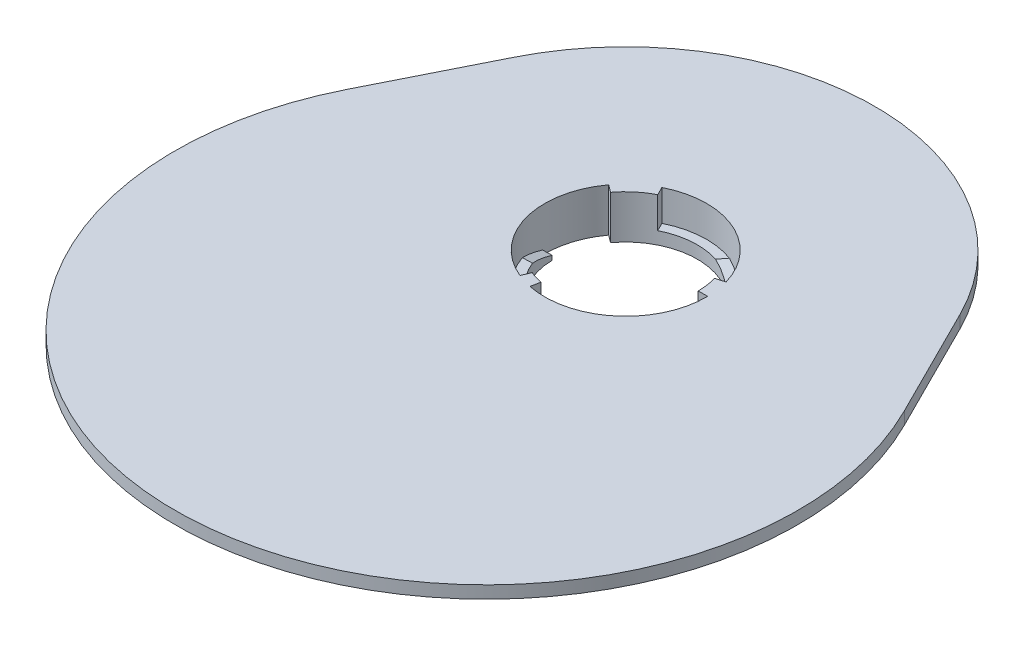
ISO-10303-21;
HEADER;
FILE_DESCRIPTION(('STEP AP214'),'2;1');
FILE_NAME('part.step','',(''),(''),'','','');
FILE_SCHEMA(('AUTOMOTIVE_DESIGN { 1 0 10303 214 1 1 1 1 }'));
ENDSEC;
DATA;
#1=APPLICATION_CONTEXT('core data for automotive mechanical design processes');
#2=APPLICATION_PROTOCOL_DEFINITION('international standard','automotive_design',2000,#1);
#3=PRODUCT_CONTEXT('',#1,'mechanical');
#4=PRODUCT('Part','Part','',(#3));
#5=PRODUCT_RELATED_PRODUCT_CATEGORY('part','',(#4));
#6=PRODUCT_DEFINITION_FORMATION('','',#4);
#7=PRODUCT_DEFINITION_CONTEXT('part definition',#1,'design');
#8=PRODUCT_DEFINITION('design','',#6,#7);
#9=PRODUCT_DEFINITION_SHAPE('','',#8);
#10=(LENGTH_UNIT() NAMED_UNIT(*) SI_UNIT(.MILLI.,.METRE.));
#11=(NAMED_UNIT(*) PLANE_ANGLE_UNIT() SI_UNIT($,.RADIAN.));
#12=(NAMED_UNIT(*) SI_UNIT($,.STERADIAN.) SOLID_ANGLE_UNIT());
#13=UNCERTAINTY_MEASURE_WITH_UNIT(LENGTH_MEASURE(1.E-05),#10,'distance_accuracy_value','');
#14=(GEOMETRIC_REPRESENTATION_CONTEXT(3) GLOBAL_UNCERTAINTY_ASSIGNED_CONTEXT((#13)) GLOBAL_UNIT_ASSIGNED_CONTEXT((#10,
#11,#12)) REPRESENTATION_CONTEXT('',''));
#15=CARTESIAN_POINT('',(0.,0.,0.));
#16=DIRECTION('',(0.,0.,1.));
#17=DIRECTION('',(1.,0.,0.));
#18=AXIS2_PLACEMENT_3D('',#15,#16,#17);
#19=CARTESIAN_POINT('',(0.,2.,0.));
#20=DIRECTION('',(0.,-1.,0.));
#21=DIRECTION('',(0.,0.,-1.));
#22=AXIS2_PLACEMENT_3D('',#19,#20,#21);
#23=CYLINDRICAL_SURFACE('',#22,13.);
#24=CARTESIAN_POINT('',(0.,2.,0.));
#25=DIRECTION('',(0.,1.,0.));
#26=DIRECTION('',(0.,0.,1.));
#27=AXIS2_PLACEMENT_3D('',#24,#25,#26);
#28=CIRCLE('',#27,13.);
#29=CARTESIAN_POINT('',(-2.65205474774603,2.,12.7266101384052));
#30=VERTEX_POINT('',#29);
#31=CARTESIAN_POINT('',(12.9989483680419,2.,-0.165352124209134));
#32=VERTEX_POINT('',#31);
#33=EDGE_CURVE('E241',#30,#32,#28,.T.);
#34=ORIENTED_EDGE('',*,*,#33,.T.);
#35=DIRECTION('',(0.,-1.,0.));
#36=VECTOR('',#35,1.);
#37=CARTESIAN_POINT('',(12.9989483680419,9.16077384253368,-0.165352124209134));
#38=LINE('',#37,#36);
#39=CARTESIAN_POINT('',(12.9989483680419,-3.,-0.165352124209134));
#40=VERTEX_POINT('',#39);
#41=EDGE_CURVE('E466',#32,#40,#38,.T.);
#42=ORIENTED_EDGE('',*,*,#41,.T.);
#43=CARTESIAN_POINT('',(0.,-3.,0.));
#44=DIRECTION('',(0.,-1.,0.));
#45=DIRECTION('',(0.,0.,-1.));
#46=AXIS2_PLACEMENT_3D('',#43,#44,#45);
#47=CIRCLE('',#46,13.);
#48=CARTESIAN_POINT('',(8.80833238270036,-3.,9.56102926655243));
#49=VERTEX_POINT('',#48);
#50=EDGE_CURVE('E419',#49,#40,#47,.F.);
#51=ORIENTED_EDGE('',*,*,#50,.F.);
#52=CARTESIAN_POINT('',(0.,-4.3,0.));
#53=DIRECTION('',(0.280679552847862,-0.951056516295154,-0.129269066004402));
#54=DIRECTION('',(-0.863842839021577,-0.309016994374947,0.397849276307769));
#55=AXIS2_PLACEMENT_3D('',#52,#53,#54);
#56=ELLIPSE('',#55,13.6690089150975,13.);
#57=CARTESIAN_POINT('',(5.43820530471597,-4.3,11.8078754678291));
#58=VERTEX_POINT('',#57);
#59=EDGE_CURVE('E316',#49,#58,#56,.T.);
#60=ORIENTED_EDGE('',*,*,#59,.T.);
#61=DIRECTION('',(0.,-1.,0.));
#62=VECTOR('',#61,1.);
#63=CARTESIAN_POINT('',(5.43820530471597,-3.,11.8078754678291));
#64=LINE('',#63,#62);
#65=CARTESIAN_POINT('',(5.43820530471597,-5.,11.8078754678291));
#66=VERTEX_POINT('',#65);
#67=EDGE_CURVE('E225',#58,#66,#64,.T.);
#68=ORIENTED_EDGE('',*,*,#67,.T.);
#69=CARTESIAN_POINT('',(0.,-5.,0.));
#70=DIRECTION('',(0.,-1.,0.));
#71=DIRECTION('',(0.,0.,-1.));
#72=AXIS2_PLACEMENT_3D('',#69,#70,#71);
#73=CIRCLE('',#72,13.);
#74=CARTESIAN_POINT('',(-2.65205474774603,-5.,12.7266101384052));
#75=VERTEX_POINT('',#74);
#76=EDGE_CURVE('E387',#66,#75,#73,.T.);
#77=ORIENTED_EDGE('',*,*,#76,.T.);
#78=DIRECTION('',(0.,-1.,0.));
#79=VECTOR('',#78,1.);
#80=CARTESIAN_POINT('',(-2.65205474774603,-3.,12.7266101384052));
#81=LINE('',#80,#79);
#82=EDGE_CURVE('E333',#30,#75,#81,.T.);
#83=ORIENTED_EDGE('',*,*,#82,.F.);
#84=EDGE_LOOP('',(#34,#42,#51,#60,#68,#77,#83));
#85=FACE_BOUND('',#84,.T.);
#86=ADVANCED_FACE('F49',(#85),#23,.F.);
#87=CARTESIAN_POINT('',(0.,-3.,0.));
#88=DIRECTION('',(0.,-1.,0.));
#89=DIRECTION('',(0.,0.,-1.));
#90=AXIS2_PLACEMENT_3D('',#87,#88,#89);
#91=PLANE('',#90);
#92=CARTESIAN_POINT('',(0.,-3.,0.));
#93=DIRECTION('',(0.,-1.,0.));
#94=DIRECTION('',(0.,0.,-1.));
#95=AXIS2_PLACEMENT_3D('',#92,#93,#94);
#96=CIRCLE('',#95,11.5);
#97=CARTESIAN_POINT('',(11.499069710191,-3.,-0.146273032954234));
#98=VERTEX_POINT('',#97);
#99=CARTESIAN_POINT('',(8.14427119786115,-3.,8.11916539157135));
#100=VERTEX_POINT('',#99);
#101=EDGE_CURVE('E416',#98,#100,#96,.T.);
#102=ORIENTED_EDGE('',*,*,#101,.T.);
#103=DIRECTION('',(0.418323484978152,0.,0.908298112909927));
#104=VECTOR('',#103,1.);
#105=CARTESIAN_POINT('',(3.63409039363529,-3.,-1.67370749381035));
#106=LINE('',#105,#104);
#107=EDGE_CURVE('E296',#100,#49,#106,.T.);
#108=ORIENTED_EDGE('',*,*,#107,.T.);
#109=ORIENTED_EDGE('',*,*,#50,.T.);
#110=DIRECTION('',(0.999919105233993,0.,-0.0127193941699334));
#111=VECTOR('',#110,1.);
#112=CARTESIAN_POINT('',(0.,-3.,0.));
#113=LINE('',#112,#111);
#114=EDGE_CURVE('E293',#98,#40,#113,.T.);
#115=ORIENTED_EDGE('',*,*,#114,.F.);
#116=EDGE_LOOP('',(#102,#108,#109,#115));
#117=FACE_BOUND('',#116,.T.);
#118=ADVANCED_FACE('F482',(#117),#91,.F.);
#119=CARTESIAN_POINT('',(-10.4594726894119,2.,-7.72006677817277));
#120=VERTEX_POINT('',#119);
#121=CARTESIAN_POINT('',(-4.96037234143088,2.,12.0164348387684));
#122=VERTEX_POINT('',#121);
#123=EDGE_CURVE('E244',#120,#122,#28,.T.);
#124=ORIENTED_EDGE('',*,*,#123,.T.);
#125=DIRECTION('',(0.,-1.,0.));
#126=VECTOR('',#125,1.);
#127=CARTESIAN_POINT('',(-4.96037234143088,9.16077384253368,12.0164348387684));
#128=LINE('',#127,#126);
#129=CARTESIAN_POINT('',(-4.96037234143088,-3.,12.0164348387684));
#130=VERTEX_POINT('',#129);
#131=EDGE_CURVE('E233',#122,#130,#128,.T.);
#132=ORIENTED_EDGE('',*,*,#131,.T.);
#133=CARTESIAN_POINT('',(0.,-3.,0.));
#134=DIRECTION('',(0.,-1.,0.));
#135=DIRECTION('',(0.,0.,-1.));
#136=AXIS2_PLACEMENT_3D('',#133,#134,#135);
#137=CIRCLE('',#136,13.);
#138=CARTESIAN_POINT('',(-12.254793292292,-3.,4.33820716001376));
#139=VERTEX_POINT('',#138);
#140=EDGE_CURVE('E322',#139,#130,#137,.F.);
#141=ORIENTED_EDGE('',*,*,#140,.F.);
#142=CARTESIAN_POINT('',(0.,-4.29999999999999,0.));
#143=DIRECTION('',(0.00846228176161861,-0.951056516295154,0.308901104886196));
#144=DIRECTION('',(-0.0260442252646721,-0.309016994374947,-0.950699845123495));
#145=AXIS2_PLACEMENT_3D('',#142,#143,#144);
#146=ELLIPSE('',#145,13.6690089150975,13.);
#147=CARTESIAN_POINT('',(-12.9951246585748,-4.29999999999999,0.355998747329609));
#148=VERTEX_POINT('',#147);
#149=EDGE_CURVE('E58',#139,#148,#146,.T.);
#150=ORIENTED_EDGE('',*,*,#149,.T.);
#151=DIRECTION('',(0.,-1.,0.));
#152=VECTOR('',#151,1.);
#153=CARTESIAN_POINT('',(-12.9951246585748,-3.,0.355998747329609));
#154=LINE('',#153,#152);
#155=CARTESIAN_POINT('',(-12.9951246585748,-5.,0.355998747329609));
#156=VERTEX_POINT('',#155);
#157=EDGE_CURVE('E320',#148,#156,#154,.T.);
#158=ORIENTED_EDGE('',*,*,#157,.T.);
#159=CARTESIAN_POINT('',(-10.4594726894119,-5.,-7.72006677817277));
#160=VERTEX_POINT('',#159);
#161=EDGE_CURVE('E380',#156,#160,#73,.T.);
#162=ORIENTED_EDGE('',*,*,#161,.T.);
#163=DIRECTION('',(0.,-1.,0.));
#164=VECTOR('',#163,1.);
#165=CARTESIAN_POINT('',(-10.4594726894119,-3.,-7.72006677817277));
#166=LINE('',#165,#164);
#167=EDGE_CURVE('E383',#120,#160,#166,.T.);
#168=ORIENTED_EDGE('',*,*,#167,.F.);
#169=EDGE_LOOP('',(#124,#132,#141,#150,#158,#162,#168));
#170=FACE_BOUND('',#169,.T.);
#171=ADVANCED_FACE('F319',(#170),#23,.F.);
#172=CARTESIAN_POINT('',(0.,-3.,0.));
#173=DIRECTION('',(0.,-1.,0.));
#174=DIRECTION('',(0.,0.,-1.));
#175=AXIS2_PLACEMENT_3D('',#172,#173,#174);
#176=PLANE('',#175);
#177=CARTESIAN_POINT('',(0.,-3.,0.));
#178=DIRECTION('',(0.,-1.,0.));
#179=DIRECTION('',(0.,0.,-1.));
#180=AXIS2_PLACEMENT_3D('',#177,#178,#179);
#181=CIRCLE('',#180,11.5);
#182=CARTESIAN_POINT('',(-4.3880216866504,-3.,10.6299231266029));
#183=VERTEX_POINT('',#182);
#184=CARTESIAN_POINT('',(-10.6679539961693,-3.,4.29473602630206));
#185=VERTEX_POINT('',#184);
#186=EDGE_CURVE('E342',#183,#185,#181,.T.);
#187=ORIENTED_EDGE('',*,*,#186,.T.);
#188=DIRECTION('',(-0.999624973736526,0.,0.0273845190253546));
#189=VECTOR('',#188,1.);
#190=CARTESIAN_POINT('',(0.109565148391134,-3.,3.99948812252357));
#191=LINE('',#190,#189);
#192=EDGE_CURVE('E303',#185,#139,#191,.T.);
#193=ORIENTED_EDGE('',*,*,#192,.T.);
#194=ORIENTED_EDGE('',*,*,#140,.T.);
#195=DIRECTION('',(-0.381567103186991,0.,0.924341141443725));
#196=VECTOR('',#195,1.);
#197=CARTESIAN_POINT('',(0.,-3.,0.));
#198=LINE('',#197,#196);
#199=EDGE_CURVE('E290',#183,#130,#198,.T.);
#200=ORIENTED_EDGE('',*,*,#199,.F.);
#201=EDGE_LOOP('',(#187,#193,#194,#200));
#202=FACE_BOUND('',#201,.T.);
#203=ADVANCED_FACE('F346',(#202),#176,.F.);
#204=DIRECTION('',(0.,-1.,0.));
#205=VECTOR('',#204,1.);
#206=CARTESIAN_POINT('',(12.481994073977,-3.,-3.6331561949913));
#207=LINE('',#206,#205);
#208=CARTESIAN_POINT('',(12.481994073977,2.,-3.6331561949913));
#209=VERTEX_POINT('',#208);
#210=CARTESIAN_POINT('',(12.481994073977,-5.,-3.6331561949913));
#211=VERTEX_POINT('',#210);
#212=EDGE_CURVE('E213',#209,#211,#207,.T.);
#213=ORIENTED_EDGE('',*,*,#212,.F.);
#214=CARTESIAN_POINT('',(-5.81462143119073,2.,-11.6271310998001));
#215=VERTEX_POINT('',#214);
#216=EDGE_CURVE('E218',#209,#215,#28,.T.);
#217=ORIENTED_EDGE('',*,*,#216,.T.);
#218=DIRECTION('',(0.,-1.,0.));
#219=VECTOR('',#218,1.);
#220=CARTESIAN_POINT('',(-5.81462143119073,9.16077384253368,-11.6271310998001));
#221=LINE('',#220,#219);
#222=CARTESIAN_POINT('',(-5.81462143119073,-3.,-11.6271310998001));
#223=VERTEX_POINT('',#222);
#224=EDGE_CURVE('E414',#215,#223,#221,.T.);
#225=ORIENTED_EDGE('',*,*,#224,.T.);
#226=CARTESIAN_POINT('',(0.,-3.,0.));
#227=DIRECTION('',(0.,-1.,0.));
#228=DIRECTION('',(0.,0.,-1.));
#229=AXIS2_PLACEMENT_3D('',#226,#227,#228);
#230=CIRCLE('',#229,13.);
#231=CARTESIAN_POINT('',(4.44753981473777,-3.,-12.2155388582052));
#232=VERTEX_POINT('',#231);
#233=EDGE_CURVE('E367',#232,#223,#230,.F.);
#234=ORIENTED_EDGE('',*,*,#233,.F.);
#235=CARTESIAN_POINT('',(0.,-4.3,0.));
#236=DIRECTION('',(-0.243738359488238,-0.951056516295153,-0.18995556039903));
#237=DIRECTION('',(0.750149536375051,-0.309016994374948,0.584623101034991));
#238=AXIS2_PLACEMENT_3D('',#235,#236,#237);
#239=ELLIPSE('',#238,13.6690089150975,13.);
#240=CARTESIAN_POINT('',(7.99121838001923,-4.3,-10.2538007003668));
#241=VERTEX_POINT('',#240);
#242=EDGE_CURVE('E13',#232,#241,#239,.T.);
#243=ORIENTED_EDGE('',*,*,#242,.T.);
#244=DIRECTION('',(0.,-1.,0.));
#245=VECTOR('',#244,1.);
#246=CARTESIAN_POINT('',(7.99121838001923,-3.,-10.2538007003668));
#247=LINE('',#246,#245);
#248=CARTESIAN_POINT('',(7.99121838001923,-5.,-10.2538007003668));
#249=VERTEX_POINT('',#248);
#250=EDGE_CURVE('E381',#241,#249,#247,.T.);
#251=ORIENTED_EDGE('',*,*,#250,.T.);
#252=EDGE_CURVE('E221',#249,#211,#73,.T.);
#253=ORIENTED_EDGE('',*,*,#252,.T.);
#254=EDGE_LOOP('',(#213,#217,#225,#234,#243,#251,#253));
#255=FACE_BOUND('',#254,.T.);
#256=ADVANCED_FACE('F215',(#255),#23,.F.);
#257=CARTESIAN_POINT('',(0.,-3.,0.));
#258=DIRECTION('',(0.,-1.,0.));
#259=DIRECTION('',(0.,0.,-1.));
#260=AXIS2_PLACEMENT_3D('',#257,#258,#259);
#261=PLANE('',#260);
#262=CARTESIAN_POINT('',(0.,-3.,0.));
#263=DIRECTION('',(0.,-1.,0.));
#264=DIRECTION('',(0.,0.,-1.));
#265=AXIS2_PLACEMENT_3D('',#262,#263,#264);
#266=CIRCLE('',#265,11.5);
#267=CARTESIAN_POINT('',(-5.14370357374565,-3.,-10.2855390498231));
#268=VERTEX_POINT('',#267);
#269=CARTESIAN_POINT('',(3.47172929483287,-3.,-10.9634436060665));
#270=VERTEX_POINT('',#269);
#271=EDGE_CURVE('E364',#268,#270,#266,.T.);
#272=ORIENTED_EDGE('',*,*,#271,.T.);
#273=DIRECTION('',(0.614709106155325,0.,-0.788753900028216));
#274=VECTOR('',#273,1.);
#275=CARTESIAN_POINT('',(-3.15579536089948,-3.,-2.45944412501573));
#276=LINE('',#275,#274);
#277=EDGE_CURVE('E310',#270,#232,#276,.T.);
#278=ORIENTED_EDGE('',*,*,#277,.T.);
#279=ORIENTED_EDGE('',*,*,#233,.T.);
#280=DIRECTION('',(-0.447278571630056,0.,-0.894394699984619));
#281=VECTOR('',#280,1.);
#282=CARTESIAN_POINT('',(0.,-3.,0.));
#283=LINE('',#282,#281);
#284=EDGE_CURVE('E287',#268,#223,#283,.T.);
#285=ORIENTED_EDGE('',*,*,#284,.F.);
#286=EDGE_LOOP('',(#272,#278,#279,#285));
#287=FACE_BOUND('',#286,.T.);
#288=ADVANCED_FACE('F446',(#287),#261,.F.);
#289=CARTESIAN_POINT('',(0.,0.,0.));
#290=DIRECTION('',(0.,-1.,0.));
#291=DIRECTION('',(0.,0.,-1.));
#292=AXIS2_PLACEMENT_3D('',#289,#290,#291);
#293=PLANE('',#292);
#294=CARTESIAN_POINT('',(0.,0.,0.));
#295=DIRECTION('',(0.,1.,0.));
#296=DIRECTION('',(0.,0.,-1.));
#297=AXIS2_PLACEMENT_3D('',#294,#295,#296);
#298=CIRCLE('',#297,40.);
#299=CARTESIAN_POINT('',(35.7770876399966,0.,-17.8885438199983));
#300=VERTEX_POINT('',#299);
#301=CARTESIAN_POINT('',(-35.7770876399966,0.,-17.8885438199983));
#302=VERTEX_POINT('',#301);
#303=EDGE_CURVE('E250',#300,#302,#298,.T.);
#304=ORIENTED_EDGE('',*,*,#303,.F.);
#305=DIRECTION('',(-0.447213595499958,0.,-0.894427190999916));
#306=VECTOR('',#305,1.);
#307=CARTESIAN_POINT('',(35.7770876399966,0.,-17.8885438199983));
#308=LINE('',#307,#306);
#309=CARTESIAN_POINT('',(44.7213595499958,0.,0.));
#310=VERTEX_POINT('',#309);
#311=EDGE_CURVE('E267',#310,#300,#308,.T.);
#312=ORIENTED_EDGE('',*,*,#311,.F.);
#313=CARTESIAN_POINT('',(0.,0.,22.3606797749979));
#314=DIRECTION('',(0.,1.,0.));
#315=DIRECTION('',(0.,0.,1.));
#316=AXIS2_PLACEMENT_3D('',#313,#314,#315);
#317=CIRCLE('',#316,50.);
#318=CARTESIAN_POINT('',(-44.7213595499958,0.,0.));
#319=VERTEX_POINT('',#318);
#320=EDGE_CURVE('E260',#319,#310,#317,.T.);
#321=ORIENTED_EDGE('',*,*,#320,.F.);
#322=DIRECTION('',(-0.447213595499958,0.,0.894427190999916));
#323=VECTOR('',#322,1.);
#324=CARTESIAN_POINT('',(-35.7770876399966,0.,-17.8885438199983));
#325=LINE('',#324,#323);
#326=EDGE_CURVE('E254',#302,#319,#325,.T.);
#327=ORIENTED_EDGE('',*,*,#326,.F.);
#328=EDGE_LOOP('',(#304,#312,#321,#327));
#329=FACE_BOUND('',#328,.T.);
#330=CARTESIAN_POINT('',(0.,0.,0.));
#331=DIRECTION('',(0.,-1.,0.));
#332=DIRECTION('',(0.,0.,-1.));
#333=AXIS2_PLACEMENT_3D('',#330,#331,#332);
#334=CIRCLE('',#333,20.);
#335=CARTESIAN_POINT('',(0.,0.,-20.));
#336=VERTEX_POINT('',#335);
#337=EDGE_CURVE('E242',#336,#336,#334,.T.);
#338=ORIENTED_EDGE('',*,*,#337,.F.);
#339=EDGE_LOOP('',(#338));
#340=FACE_BOUND('',#339,.T.);
#341=ADVANCED_FACE('F509',(#329,#340),#293,.T.);
#342=CARTESIAN_POINT('',(0.,2.,0.));
#343=DIRECTION('',(0.,-1.,0.));
#344=DIRECTION('',(0.,0.,-1.));
#345=AXIS2_PLACEMENT_3D('',#342,#343,#344);
#346=PLANE('',#345);
#347=CARTESIAN_POINT('',(0.,2.,0.));
#348=DIRECTION('',(0.,1.,0.));
#349=DIRECTION('',(0.,0.,-1.));
#350=AXIS2_PLACEMENT_3D('',#347,#348,#349);
#351=CIRCLE('',#350,40.);
#352=CARTESIAN_POINT('',(35.7770876399966,2.,-17.8885438199983));
#353=VERTEX_POINT('',#352);
#354=CARTESIAN_POINT('',(-35.7770876399966,2.,-17.8885438199983));
#355=VERTEX_POINT('',#354);
#356=EDGE_CURVE('E269',#353,#355,#351,.T.);
#357=ORIENTED_EDGE('',*,*,#356,.T.);
#358=DIRECTION('',(-0.447213595499958,0.,0.894427190999916));
#359=VECTOR('',#358,1.);
#360=CARTESIAN_POINT('',(-35.7770876399966,2.,-17.8885438199983));
#361=LINE('',#360,#359);
#362=CARTESIAN_POINT('',(-44.7213595499958,2.,0.));
#363=VERTEX_POINT('',#362);
#364=EDGE_CURVE('E828',#355,#363,#361,.T.);
#365=ORIENTED_EDGE('',*,*,#364,.T.);
#366=CARTESIAN_POINT('',(0.,2.,22.3606797749979));
#367=DIRECTION('',(0.,1.,0.));
#368=DIRECTION('',(0.,0.,1.));
#369=AXIS2_PLACEMENT_3D('',#366,#367,#368);
#370=CIRCLE('',#369,50.);
#371=CARTESIAN_POINT('',(44.7213595499958,2.,0.));
#372=VERTEX_POINT('',#371);
#373=EDGE_CURVE('E822',#363,#372,#370,.T.);
#374=ORIENTED_EDGE('',*,*,#373,.T.);
#375=DIRECTION('',(-0.447213595499958,0.,-0.894427190999916));
#376=VECTOR('',#375,1.);
#377=CARTESIAN_POINT('',(35.7770876399966,2.,-17.8885438199983));
#378=LINE('',#377,#376);
#379=EDGE_CURVE('E263',#372,#353,#378,.T.);
#380=ORIENTED_EDGE('',*,*,#379,.T.);
#381=EDGE_LOOP('',(#357,#365,#374,#380));
#382=FACE_BOUND('',#381,.T.);
#383=ORIENTED_EDGE('',*,*,#123,.F.);
#384=DIRECTION('',(0.804574822262453,0.,0.593851290628675));
#385=VECTOR('',#384,1.);
#386=CARTESIAN_POINT('',(0.,2.,0.));
#387=LINE('',#386,#385);
#388=CARTESIAN_POINT('',(-9.25261045601823,2.,-6.82928984222977));
#389=VERTEX_POINT('',#388);
#390=EDGE_CURVE('E394',#120,#389,#387,.T.);
#391=ORIENTED_EDGE('',*,*,#390,.T.);
#392=CARTESIAN_POINT('',(0.,2.,0.));
#393=DIRECTION('',(0.,-1.,0.));
#394=DIRECTION('',(0.,0.,-1.));
#395=AXIS2_PLACEMENT_3D('',#392,#393,#394);
#396=CIRCLE('',#395,11.5);
#397=CARTESIAN_POINT('',(-5.14370357374566,2.,-10.2855390498231));
#398=VERTEX_POINT('',#397);
#399=EDGE_CURVE('E405',#398,#389,#396,.F.);
#400=ORIENTED_EDGE('',*,*,#399,.F.);
#401=DIRECTION('',(0.447278571630056,0.,0.894394699984619));
#402=VECTOR('',#401,1.);
#403=CARTESIAN_POINT('',(0.,2.,0.));
#404=LINE('',#403,#402);
#405=EDGE_CURVE('E239',#215,#398,#404,.T.);
#406=ORIENTED_EDGE('',*,*,#405,.F.);
#407=ORIENTED_EDGE('',*,*,#216,.F.);
#408=DIRECTION('',(-0.960153390305921,0.,0.279473553460869));
#409=VECTOR('',#408,1.);
#410=CARTESIAN_POINT('',(0.,2.,0.));
#411=LINE('',#410,#409);
#412=CARTESIAN_POINT('',(11.0417639885181,2.,-3.21394586480001));
#413=VERTEX_POINT('',#412);
#414=EDGE_CURVE('E229',#209,#413,#411,.T.);
#415=ORIENTED_EDGE('',*,*,#414,.T.);
#416=CARTESIAN_POINT('',(0.,2.,0.));
#417=DIRECTION('',(0.,-1.,0.));
#418=DIRECTION('',(0.,0.,-1.));
#419=AXIS2_PLACEMENT_3D('',#416,#417,#418);
#420=CIRCLE('',#419,11.5);
#421=CARTESIAN_POINT('',(11.499069710191,2.,-0.146273032954234));
#422=VERTEX_POINT('',#421);
#423=EDGE_CURVE('E234',#422,#413,#420,.F.);
#424=ORIENTED_EDGE('',*,*,#423,.F.);
#425=DIRECTION('',(-0.999919105233993,0.,0.0127193941699334));
#426=VECTOR('',#425,1.);
#427=CARTESIAN_POINT('',(0.,2.,0.));
#428=LINE('',#427,#426);
#429=EDGE_CURVE('E471',#32,#422,#428,.T.);
#430=ORIENTED_EDGE('',*,*,#429,.F.);
#431=ORIENTED_EDGE('',*,*,#33,.F.);
#432=DIRECTION('',(0.204004211365079,0.,-0.978970010646553));
#433=VECTOR('',#432,1.);
#434=CARTESIAN_POINT('',(0.,2.,0.));
#435=LINE('',#434,#433);
#436=CARTESIAN_POINT('',(-2.34604843069841,2.,11.2581551224354));
#437=VERTEX_POINT('',#436);
#438=EDGE_CURVE('E450',#30,#437,#435,.T.);
#439=ORIENTED_EDGE('',*,*,#438,.T.);
#440=CARTESIAN_POINT('',(0.,2.,0.));
#441=DIRECTION('',(0.,-1.,0.));
#442=DIRECTION('',(0.,0.,-1.));
#443=AXIS2_PLACEMENT_3D('',#440,#441,#442);
#444=CIRCLE('',#443,11.5);
#445=CARTESIAN_POINT('',(-4.3880216866504,2.,10.6299231266029));
#446=VERTEX_POINT('',#445);
#447=EDGE_CURVE('E452',#446,#437,#444,.F.);
#448=ORIENTED_EDGE('',*,*,#447,.F.);
#449=DIRECTION('',(0.381567103186991,0.,-0.924341141443725));
#450=VECTOR('',#449,1.);
#451=CARTESIAN_POINT('',(0.,2.,0.));
#452=LINE('',#451,#450);
#453=EDGE_CURVE('E457',#122,#446,#452,.T.);
#454=ORIENTED_EDGE('',*,*,#453,.F.);
#455=EDGE_LOOP('',(#383,#391,#400,#406,#407,#415,#424,#430,#431,#439,#448,#454));
#456=FACE_BOUND('',#455,.T.);
#457=ADVANCED_FACE('F237',(#382,#456),#346,.F.);
#458=CARTESIAN_POINT('',(0.,2.,0.));
#459=DIRECTION('',(0.,-1.,0.));
#460=DIRECTION('',(0.,0.,-1.));
#461=AXIS2_PLACEMENT_3D('',#458,#459,#460);
#462=CYLINDRICAL_SURFACE('',#461,40.);
#463=ORIENTED_EDGE('',*,*,#303,.T.);
#464=DIRECTION('',(0.,-1.,0.));
#465=VECTOR('',#464,1.);
#466=CARTESIAN_POINT('',(-35.7770876399966,2.,-17.8885438199983));
#467=LINE('',#466,#465);
#468=EDGE_CURVE('E278',#355,#302,#467,.T.);
#469=ORIENTED_EDGE('',*,*,#468,.F.);
#470=ORIENTED_EDGE('',*,*,#356,.F.);
#471=DIRECTION('',(0.,-1.,0.));
#472=VECTOR('',#471,1.);
#473=CARTESIAN_POINT('',(35.7770876399966,2.,-17.8885438199983));
#474=LINE('',#473,#472);
#475=EDGE_CURVE('E270',#353,#300,#474,.T.);
#476=ORIENTED_EDGE('',*,*,#475,.T.);
#477=EDGE_LOOP('',(#463,#469,#470,#476));
#478=FACE_BOUND('',#477,.T.);
#479=ADVANCED_FACE('F551',(#478),#462,.T.);
#480=CARTESIAN_POINT('',(-35.7770876399966,2.,-17.8885438199983));
#481=DIRECTION('',(0.894427190999916,0.,0.447213595499958));
#482=DIRECTION('',(0.447213595499958,0.,-0.894427190999916));
#483=AXIS2_PLACEMENT_3D('',#480,#481,#482);
#484=PLANE('',#483);
#485=ORIENTED_EDGE('',*,*,#326,.T.);
#486=DIRECTION('',(0.,-1.,0.));
#487=VECTOR('',#486,1.);
#488=CARTESIAN_POINT('',(-44.7213595499958,2.,0.));
#489=LINE('',#488,#487);
#490=EDGE_CURVE('E275',#363,#319,#489,.T.);
#491=ORIENTED_EDGE('',*,*,#490,.F.);
#492=ORIENTED_EDGE('',*,*,#364,.F.);
#493=ORIENTED_EDGE('',*,*,#468,.T.);
#494=EDGE_LOOP('',(#485,#491,#492,#493));
#495=FACE_BOUND('',#494,.T.);
#496=ADVANCED_FACE('F560',(#495),#484,.F.);
#497=CARTESIAN_POINT('',(0.,2.,22.3606797749979));
#498=DIRECTION('',(0.,-1.,0.));
#499=DIRECTION('',(0.,0.,-1.));
#500=AXIS2_PLACEMENT_3D('',#497,#498,#499);
#501=CYLINDRICAL_SURFACE('',#500,50.);
#502=ORIENTED_EDGE('',*,*,#320,.T.);
#503=DIRECTION('',(0.,-1.,0.));
#504=VECTOR('',#503,1.);
#505=CARTESIAN_POINT('',(44.7213595499958,2.,0.));
#506=LINE('',#505,#504);
#507=EDGE_CURVE('E272',#372,#310,#506,.T.);
#508=ORIENTED_EDGE('',*,*,#507,.F.);
#509=ORIENTED_EDGE('',*,*,#373,.F.);
#510=ORIENTED_EDGE('',*,*,#490,.T.);
#511=EDGE_LOOP('',(#502,#508,#509,#510));
#512=FACE_BOUND('',#511,.T.);
#513=ADVANCED_FACE('F556',(#512),#501,.T.);
#514=CARTESIAN_POINT('',(35.7770876399966,2.,-17.8885438199983));
#515=DIRECTION('',(-0.894427190999916,0.,0.447213595499958));
#516=DIRECTION('',(0.447213595499958,0.,0.894427190999916));
#517=AXIS2_PLACEMENT_3D('',#514,#515,#516);
#518=PLANE('',#517);
#519=ORIENTED_EDGE('',*,*,#311,.T.);
#520=ORIENTED_EDGE('',*,*,#475,.F.);
#521=ORIENTED_EDGE('',*,*,#379,.F.);
#522=ORIENTED_EDGE('',*,*,#507,.T.);
#523=EDGE_LOOP('',(#519,#520,#521,#522));
#524=FACE_BOUND('',#523,.T.);
#525=ADVANCED_FACE('F534',(#524),#518,.F.);
#526=CARTESIAN_POINT('',(0.,-5.,0.));
#527=DIRECTION('',(0.,-1.,0.));
#528=DIRECTION('',(0.,0.,-1.));
#529=AXIS2_PLACEMENT_3D('',#526,#527,#528);
#530=PLANE('',#529);
#531=DIRECTION('',(0.418323484978152,0.,0.908298112909927));
#532=VECTOR('',#531,1.);
#533=CARTESIAN_POINT('',(0.,-5.,0.));
#534=LINE('',#533,#532);
#535=CARTESIAN_POINT('',(4.81072007724875,-5.,10.4454282984642));
#536=VERTEX_POINT('',#535);
#537=EDGE_CURVE('E420',#536,#66,#534,.T.);
#538=ORIENTED_EDGE('',*,*,#537,.F.);
#539=CARTESIAN_POINT('',(0.,-5.,0.));
#540=DIRECTION('',(0.,-1.,0.));
#541=DIRECTION('',(0.,0.,-1.));
#542=AXIS2_PLACEMENT_3D('',#539,#540,#541);
#543=CIRCLE('',#542,11.5);
#544=CARTESIAN_POINT('',(11.0417639885181,-5.,-3.21394586480001));
#545=VERTEX_POINT('',#544);
#546=EDGE_CURVE('E406',#545,#536,#543,.T.);
#547=ORIENTED_EDGE('',*,*,#546,.F.);
#548=DIRECTION('',(0.960153390305921,0.,-0.27947355346087));
#549=VECTOR('',#548,1.);
#550=CARTESIAN_POINT('',(0.,-5.,0.));
#551=LINE('',#550,#549);
#552=EDGE_CURVE('E409',#545,#211,#551,.T.);
#553=ORIENTED_EDGE('',*,*,#552,.T.);
#554=ORIENTED_EDGE('',*,*,#252,.F.);
#555=DIRECTION('',(0.614709106155325,0.,-0.788753900028216));
#556=VECTOR('',#555,1.);
#557=CARTESIAN_POINT('',(0.,-5.,0.));
#558=LINE('',#557,#556);
#559=CARTESIAN_POINT('',(7.06915472078626,-5.,-9.07066985032451));
#560=VERTEX_POINT('',#559);
#561=EDGE_CURVE('E368',#560,#249,#558,.T.);
#562=ORIENTED_EDGE('',*,*,#561,.F.);
#563=CARTESIAN_POINT('',(0.,-5.,0.));
#564=DIRECTION('',(0.,-1.,0.));
#565=DIRECTION('',(0.,0.,-1.));
#566=AXIS2_PLACEMENT_3D('',#563,#564,#565);
#567=CIRCLE('',#566,11.5);
#568=CARTESIAN_POINT('',(-9.25261045601823,-5.,-6.82928984222977));
#569=VERTEX_POINT('',#568);
#570=EDGE_CURVE('E359',#569,#560,#567,.T.);
#571=ORIENTED_EDGE('',*,*,#570,.F.);
#572=DIRECTION('',(-0.804574822262453,0.,-0.593851290628675));
#573=VECTOR('',#572,1.);
#574=CARTESIAN_POINT('',(0.,-5.,0.));
#575=LINE('',#574,#573);
#576=EDGE_CURVE('E373',#569,#160,#575,.T.);
#577=ORIENTED_EDGE('',*,*,#576,.T.);
#578=ORIENTED_EDGE('',*,*,#161,.F.);
#579=DIRECTION('',(-0.999624973736526,0.,0.0273845190253546));
#580=VECTOR('',#579,1.);
#581=CARTESIAN_POINT('',(0.,-5.,0.));
#582=LINE('',#581,#580);
#583=CARTESIAN_POINT('',(-11.4956871979701,-5.,0.314921968791578));
#584=VERTEX_POINT('',#583);
#585=EDGE_CURVE('E331',#584,#156,#582,.T.);
#586=ORIENTED_EDGE('',*,*,#585,.F.);
#587=CARTESIAN_POINT('',(0.,-5.,0.));
#588=DIRECTION('',(0.,-1.,0.));
#589=DIRECTION('',(0.,0.,-1.));
#590=AXIS2_PLACEMENT_3D('',#587,#588,#589);
#591=CIRCLE('',#590,11.5);
#592=CARTESIAN_POINT('',(-2.34604843069841,-5.,11.2581551224354));
#593=VERTEX_POINT('',#592);
#594=EDGE_CURVE('E354',#593,#584,#591,.T.);
#595=ORIENTED_EDGE('',*,*,#594,.F.);
#596=DIRECTION('',(-0.204004211365079,0.,0.978970010646553));
#597=VECTOR('',#596,1.);
#598=CARTESIAN_POINT('',(0.,-5.,0.));
#599=LINE('',#598,#597);
#600=EDGE_CURVE('E350',#593,#75,#599,.T.);
#601=ORIENTED_EDGE('',*,*,#600,.T.);
#602=ORIENTED_EDGE('',*,*,#76,.F.);
#603=EDGE_LOOP('',(#538,#547,#553,#554,#562,#571,#577,#578,#586,#595,#601,#602));
#604=FACE_BOUND('',#603,.T.);
#605=CARTESIAN_POINT('',(0.,-5.,0.));
#606=DIRECTION('',(0.,-1.,0.));
#607=DIRECTION('',(0.,0.,-1.));
#608=AXIS2_PLACEMENT_3D('',#605,#606,#607);
#609=CIRCLE('',#608,17.);
#610=CARTESIAN_POINT('',(0.,-5.,-17.));
#611=VERTEX_POINT('',#610);
#612=EDGE_CURVE('E281',#611,#611,#609,.T.);
#613=ORIENTED_EDGE('',*,*,#612,.T.);
#614=EDGE_LOOP('',(#613));
#615=FACE_BOUND('',#614,.T.);
#616=ADVANCED_FACE('F397',(#604,#615),#530,.T.);
#617=CARTESIAN_POINT('',(0.,-5.,0.));
#618=DIRECTION('',(0.,1.,0.));
#619=DIRECTION('',(0.,0.,1.));
#620=AXIS2_PLACEMENT_3D('',#617,#618,#619);
#621=CYLINDRICAL_SURFACE('',#620,20.);
#622=CARTESIAN_POINT('',(0.,-1.99999999999999,0.));
#623=DIRECTION('',(0.,-1.,0.));
#624=DIRECTION('',(0.,0.,-1.));
#625=AXIS2_PLACEMENT_3D('',#622,#623,#624);
#626=CIRCLE('',#625,20.);
#627=CARTESIAN_POINT('',(0.,-1.99999999999999,-20.));
#628=VERTEX_POINT('',#627);
#629=EDGE_CURVE('E284',#628,#628,#626,.F.);
#630=ORIENTED_EDGE('',*,*,#629,.T.);
#631=EDGE_LOOP('',(#630));
#632=FACE_BOUND('',#631,.T.);
#633=ORIENTED_EDGE('',*,*,#337,.T.);
#634=EDGE_LOOP('',(#633));
#635=FACE_BOUND('',#634,.T.);
#636=ADVANCED_FACE('F533',(#632,#635),#621,.T.);
#637=CARTESIAN_POINT('',(0.,-5.,0.));
#638=DIRECTION('',(0.,1.,0.));
#639=DIRECTION('',(0.,0.,1.));
#640=AXIS2_PLACEMENT_3D('',#637,#638,#639);
#641=CONICAL_SURFACE('',#640,17.,0.785398163397446);
#642=ORIENTED_EDGE('',*,*,#629,.F.);
#643=EDGE_LOOP('',(#642));
#644=FACE_BOUND('',#643,.T.);
#645=ORIENTED_EDGE('',*,*,#612,.F.);
#646=EDGE_LOOP('',(#645));
#647=FACE_BOUND('',#646,.T.);
#648=ADVANCED_FACE('F531',(#644,#647),#641,.T.);
#649=CARTESIAN_POINT('',(0.,-3.,0.));
#650=DIRECTION('',(0.,-1.,0.));
#651=DIRECTION('',(0.,0.,-1.));
#652=AXIS2_PLACEMENT_3D('',#649,#650,#651);
#653=CYLINDRICAL_SURFACE('',#652,11.5);
#654=DIRECTION('',(0.,-1.,0.));
#655=VECTOR('',#654,1.);
#656=CARTESIAN_POINT('',(7.06915472078626,-3.,-9.07066985032451));
#657=LINE('',#656,#655);
#658=CARTESIAN_POINT('',(7.06915472078626,-4.3,-9.07066985032451));
#659=VERTEX_POINT('',#658);
#660=EDGE_CURVE('E378',#659,#560,#657,.T.);
#661=ORIENTED_EDGE('',*,*,#660,.F.);
#662=CARTESIAN_POINT('',(0.,-4.3,0.));
#663=DIRECTION('',(-0.243738359488238,-0.951056516295153,-0.18995556039903));
#664=DIRECTION('',(0.750149536375051,-0.309016994374948,0.584623101034991));
#665=AXIS2_PLACEMENT_3D('',#662,#663,#664);
#666=ELLIPSE('',#665,12.0918155787401,11.5);
#667=EDGE_CURVE('E314',#659,#270,#666,.F.);
#668=ORIENTED_EDGE('',*,*,#667,.T.);
#669=ORIENTED_EDGE('',*,*,#271,.F.);
#670=DIRECTION('',(0.,-1.,0.));
#671=VECTOR('',#670,1.);
#672=CARTESIAN_POINT('',(-5.14370357374565,9.16077384253368,-10.2855390498231));
#673=LINE('',#672,#671);
#674=EDGE_CURVE('E449',#398,#268,#673,.T.);
#675=ORIENTED_EDGE('',*,*,#674,.F.);
#676=ORIENTED_EDGE('',*,*,#399,.T.);
#677=DIRECTION('',(0.,-1.,0.));
#678=VECTOR('',#677,1.);
#679=CARTESIAN_POINT('',(-9.25261045601823,-3.,-6.82928984222977));
#680=LINE('',#679,#678);
#681=EDGE_CURVE('E370',#389,#569,#680,.T.);
#682=ORIENTED_EDGE('',*,*,#681,.T.);
#683=ORIENTED_EDGE('',*,*,#570,.T.);
#684=EDGE_LOOP('',(#661,#668,#669,#675,#676,#682,#683));
#685=FACE_BOUND('',#684,.T.);
#686=ADVANCED_FACE('F401',(#685),#653,.F.);
#687=CARTESIAN_POINT('',(0.,-3.,0.));
#688=DIRECTION('',(-0.788753900028216,0.,-0.614709106155325));
#689=DIRECTION('',(-0.614709106155325,0.,0.788753900028216));
#690=AXIS2_PLACEMENT_3D('',#687,#688,#689);
#691=PLANE('',#690);
#692=ORIENTED_EDGE('',*,*,#250,.F.);
#693=DIRECTION('',(-0.614709106155325,0.,0.788753900028216));
#694=VECTOR('',#693,1.);
#695=CARTESIAN_POINT('',(0.,-4.3,0.));
#696=LINE('',#695,#694);
#697=EDGE_CURVE('E65',#241,#659,#696,.T.);
#698=ORIENTED_EDGE('',*,*,#697,.T.);
#699=ORIENTED_EDGE('',*,*,#660,.T.);
#700=ORIENTED_EDGE('',*,*,#561,.T.);
#701=EDGE_LOOP('',(#692,#698,#699,#700));
#702=FACE_BOUND('',#701,.T.);
#703=ADVANCED_FACE('F440',(#702),#691,.F.);
#704=CARTESIAN_POINT('',(0.,-3.,0.));
#705=DIRECTION('',(-0.593851290628675,0.,0.804574822262453));
#706=DIRECTION('',(0.804574822262453,0.,0.593851290628675));
#707=AXIS2_PLACEMENT_3D('',#704,#705,#706);
#708=PLANE('',#707);
#709=ORIENTED_EDGE('',*,*,#576,.F.);
#710=ORIENTED_EDGE('',*,*,#681,.F.);
#711=ORIENTED_EDGE('',*,*,#390,.F.);
#712=ORIENTED_EDGE('',*,*,#167,.T.);
#713=EDGE_LOOP('',(#709,#710,#711,#712));
#714=FACE_BOUND('',#713,.T.);
#715=ADVANCED_FACE('F392',(#714),#708,.T.);
#716=CARTESIAN_POINT('',(0.,-3.,0.));
#717=DIRECTION('',(0.,-1.,0.));
#718=DIRECTION('',(0.,0.,-1.));
#719=AXIS2_PLACEMENT_3D('',#716,#717,#718);
#720=CYLINDRICAL_SURFACE('',#719,11.5);
#721=DIRECTION('',(0.,-1.,0.));
#722=VECTOR('',#721,1.);
#723=CARTESIAN_POINT('',(-11.4956871979701,-3.,0.314921968791578));
#724=LINE('',#723,#722);
#725=CARTESIAN_POINT('',(-11.4956871979701,-4.29999999999999,0.314921968791578));
#726=VERTEX_POINT('',#725);
#727=EDGE_CURVE('E332',#726,#584,#724,.T.);
#728=ORIENTED_EDGE('',*,*,#727,.F.);
#729=CARTESIAN_POINT('',(0.,-4.29999999999999,0.));
#730=DIRECTION('',(0.00846228176161861,-0.951056516295154,0.308901104886196));
#731=DIRECTION('',(-0.0260442252646721,-0.309016994374947,-0.950699845123495));
#732=AXIS2_PLACEMENT_3D('',#729,#730,#731);
#733=ELLIPSE('',#732,12.0918155787401,11.5);
#734=EDGE_CURVE('E308',#726,#185,#733,.F.);
#735=ORIENTED_EDGE('',*,*,#734,.T.);
#736=ORIENTED_EDGE('',*,*,#186,.F.);
#737=DIRECTION('',(0.,-1.,0.));
#738=VECTOR('',#737,1.);
#739=CARTESIAN_POINT('',(-4.3880216866504,9.16077384253368,10.6299231266029));
#740=LINE('',#739,#738);
#741=EDGE_CURVE('E462',#446,#183,#740,.T.);
#742=ORIENTED_EDGE('',*,*,#741,.F.);
#743=ORIENTED_EDGE('',*,*,#447,.T.);
#744=DIRECTION('',(0.,-1.,0.));
#745=VECTOR('',#744,1.);
#746=CARTESIAN_POINT('',(-2.34604843069841,-3.,11.2581551224354));
#747=LINE('',#746,#745);
#748=EDGE_CURVE('E348',#437,#593,#747,.T.);
#749=ORIENTED_EDGE('',*,*,#748,.T.);
#750=ORIENTED_EDGE('',*,*,#594,.T.);
#751=EDGE_LOOP('',(#728,#735,#736,#742,#743,#749,#750));
#752=FACE_BOUND('',#751,.T.);
#753=ADVANCED_FACE('F340',(#752),#720,.F.);
#754=CARTESIAN_POINT('',(0.,-3.,0.));
#755=DIRECTION('',(0.0273845190253546,0.,0.999624973736526));
#756=DIRECTION('',(0.999624973736526,0.,-0.0273845190253546));
#757=AXIS2_PLACEMENT_3D('',#754,#755,#756);
#758=PLANE('',#757);
#759=ORIENTED_EDGE('',*,*,#157,.F.);
#760=DIRECTION('',(0.999624973736526,0.,-0.0273845190253546));
#761=VECTOR('',#760,1.);
#762=CARTESIAN_POINT('',(0.,-4.29999999999999,0.));
#763=LINE('',#762,#761);
#764=EDGE_CURVE('E306',#148,#726,#763,.T.);
#765=ORIENTED_EDGE('',*,*,#764,.T.);
#766=ORIENTED_EDGE('',*,*,#727,.T.);
#767=ORIENTED_EDGE('',*,*,#585,.T.);
#768=EDGE_LOOP('',(#759,#765,#766,#767));
#769=FACE_BOUND('',#768,.T.);
#770=ADVANCED_FACE('F328',(#769),#758,.F.);
#771=CARTESIAN_POINT('',(0.,-3.,0.));
#772=DIRECTION('',(0.978970010646553,0.,0.204004211365079));
#773=DIRECTION('',(0.204004211365079,0.,-0.978970010646553));
#774=AXIS2_PLACEMENT_3D('',#771,#772,#773);
#775=PLANE('',#774);
#776=ORIENTED_EDGE('',*,*,#600,.F.);
#777=ORIENTED_EDGE('',*,*,#748,.F.);
#778=ORIENTED_EDGE('',*,*,#438,.F.);
#779=ORIENTED_EDGE('',*,*,#82,.T.);
#780=EDGE_LOOP('',(#776,#777,#778,#779));
#781=FACE_BOUND('',#780,.T.);
#782=ADVANCED_FACE('F519',(#781),#775,.T.);
#783=CARTESIAN_POINT('',(0.,-3.,0.));
#784=DIRECTION('',(0.,-1.,0.));
#785=DIRECTION('',(0.,0.,-1.));
#786=AXIS2_PLACEMENT_3D('',#783,#784,#785);
#787=CYLINDRICAL_SURFACE('',#786,11.5);
#788=DIRECTION('',(0.,-1.,0.));
#789=VECTOR('',#788,1.);
#790=CARTESIAN_POINT('',(4.81072007724875,-3.,10.4454282984642));
#791=LINE('',#790,#789);
#792=CARTESIAN_POINT('',(4.81072007724875,-4.3,10.4454282984642));
#793=VERTEX_POINT('',#792);
#794=EDGE_CURVE('E356',#793,#536,#791,.T.);
#795=ORIENTED_EDGE('',*,*,#794,.F.);
#796=CARTESIAN_POINT('',(0.,-4.3,0.));
#797=DIRECTION('',(0.280679552847862,-0.951056516295154,-0.129269066004402));
#798=DIRECTION('',(-0.863842839021577,-0.309016994374947,0.397849276307769));
#799=AXIS2_PLACEMENT_3D('',#796,#797,#798);
#800=ELLIPSE('',#799,12.0918155787401,11.5);
#801=EDGE_CURVE('E301',#793,#100,#800,.F.);
#802=ORIENTED_EDGE('',*,*,#801,.T.);
#803=ORIENTED_EDGE('',*,*,#101,.F.);
#804=DIRECTION('',(0.,-1.,0.));
#805=VECTOR('',#804,1.);
#806=CARTESIAN_POINT('',(11.499069710191,9.16077384253368,-0.146273032954234));
#807=LINE('',#806,#805);
#808=EDGE_CURVE('E469',#422,#98,#807,.T.);
#809=ORIENTED_EDGE('',*,*,#808,.F.);
#810=ORIENTED_EDGE('',*,*,#423,.T.);
#811=DIRECTION('',(0.,-1.,0.));
#812=VECTOR('',#811,1.);
#813=CARTESIAN_POINT('',(11.0417639885181,-3.,-3.21394586480001));
#814=LINE('',#813,#812);
#815=EDGE_CURVE('E226',#413,#545,#814,.T.);
#816=ORIENTED_EDGE('',*,*,#815,.T.);
#817=ORIENTED_EDGE('',*,*,#546,.T.);
#818=EDGE_LOOP('',(#795,#802,#803,#809,#810,#816,#817));
#819=FACE_BOUND('',#818,.T.);
#820=ADVANCED_FACE('F439',(#819),#787,.F.);
#821=CARTESIAN_POINT('',(0.,-3.,0.));
#822=DIRECTION('',(0.908298112909927,0.,-0.418323484978152));
#823=DIRECTION('',(-0.418323484978152,0.,-0.908298112909927));
#824=AXIS2_PLACEMENT_3D('',#821,#822,#823);
#825=PLANE('',#824);
#826=ORIENTED_EDGE('',*,*,#67,.F.);
#827=DIRECTION('',(-0.418323484978152,0.,-0.908298112909927));
#828=VECTOR('',#827,1.);
#829=CARTESIAN_POINT('',(0.,-4.3,0.));
#830=LINE('',#829,#828);
#831=EDGE_CURVE('E299',#58,#793,#830,.T.);
#832=ORIENTED_EDGE('',*,*,#831,.T.);
#833=ORIENTED_EDGE('',*,*,#794,.T.);
#834=ORIENTED_EDGE('',*,*,#537,.T.);
#835=EDGE_LOOP('',(#826,#832,#833,#834));
#836=FACE_BOUND('',#835,.T.);
#837=ADVANCED_FACE('F435',(#836),#825,.F.);
#838=CARTESIAN_POINT('',(0.,-3.,0.));
#839=DIRECTION('',(-0.279473553460869,0.,-0.960153390305921));
#840=DIRECTION('',(-0.960153390305921,0.,0.27947355346087));
#841=AXIS2_PLACEMENT_3D('',#838,#839,#840);
#842=PLANE('',#841);
#843=ORIENTED_EDGE('',*,*,#552,.F.);
#844=ORIENTED_EDGE('',*,*,#815,.F.);
#845=ORIENTED_EDGE('',*,*,#414,.F.);
#846=ORIENTED_EDGE('',*,*,#212,.T.);
#847=EDGE_LOOP('',(#843,#844,#845,#846));
#848=FACE_BOUND('',#847,.T.);
#849=ADVANCED_FACE('F230',(#848),#842,.T.);
#850=CARTESIAN_POINT('',(0.,9.16077384253368,0.));
#851=DIRECTION('',(-0.894394699984619,0.,0.447278571630056));
#852=DIRECTION('',(0.447278571630056,0.,0.894394699984619));
#853=AXIS2_PLACEMENT_3D('',#850,#851,#852);
#854=PLANE('',#853);
#855=ORIENTED_EDGE('',*,*,#674,.T.);
#856=ORIENTED_EDGE('',*,*,#284,.T.);
#857=ORIENTED_EDGE('',*,*,#224,.F.);
#858=ORIENTED_EDGE('',*,*,#405,.T.);
#859=EDGE_LOOP('',(#855,#856,#857,#858));
#860=FACE_BOUND('',#859,.T.);
#861=ADVANCED_FACE('F448',(#860),#854,.F.);
#862=CARTESIAN_POINT('',(0.,9.16077384253368,0.));
#863=DIRECTION('',(0.924341141443725,0.,0.38156710318699));
#864=DIRECTION('',(0.381567103186991,0.,-0.924341141443725));
#865=AXIS2_PLACEMENT_3D('',#862,#863,#864);
#866=PLANE('',#865);
#867=ORIENTED_EDGE('',*,*,#741,.T.);
#868=ORIENTED_EDGE('',*,*,#199,.T.);
#869=ORIENTED_EDGE('',*,*,#131,.F.);
#870=ORIENTED_EDGE('',*,*,#453,.T.);
#871=EDGE_LOOP('',(#867,#868,#869,#870));
#872=FACE_BOUND('',#871,.T.);
#873=ADVANCED_FACE('F491',(#872),#866,.F.);
#874=CARTESIAN_POINT('',(0.,9.16077384253368,0.));
#875=DIRECTION('',(-0.0127193941699334,0.,-0.999919105233993));
#876=DIRECTION('',(-0.999919105233993,0.,0.0127193941699334));
#877=AXIS2_PLACEMENT_3D('',#874,#875,#876);
#878=PLANE('',#877);
#879=ORIENTED_EDGE('',*,*,#808,.T.);
#880=ORIENTED_EDGE('',*,*,#114,.T.);
#881=ORIENTED_EDGE('',*,*,#41,.F.);
#882=ORIENTED_EDGE('',*,*,#429,.T.);
#883=EDGE_LOOP('',(#879,#880,#881,#882));
#884=FACE_BOUND('',#883,.T.);
#885=ADVANCED_FACE('F477',(#884),#878,.F.);
#886=CARTESIAN_POINT('',(3.63409039363529,-3.,-1.67370749381034));
#887=DIRECTION('',(0.280679552847862,-0.951056516295154,-0.129269066004402));
#888=DIRECTION('',(0.418323484978152,0.,0.908298112909927));
#889=AXIS2_PLACEMENT_3D('',#886,#887,#888);
#890=PLANE('',#889);
#891=ORIENTED_EDGE('',*,*,#801,.F.);
#892=ORIENTED_EDGE('',*,*,#831,.F.);
#893=ORIENTED_EDGE('',*,*,#59,.F.);
#894=ORIENTED_EDGE('',*,*,#107,.F.);
#895=EDGE_LOOP('',(#891,#892,#893,#894));
#896=FACE_BOUND('',#895,.T.);
#897=ADVANCED_FACE('F484',(#896),#890,.F.);
#898=CARTESIAN_POINT('',(0.109565148391134,-3.,3.99948812252357));
#899=DIRECTION('',(0.00846228176161861,-0.951056516295154,0.308901104886196));
#900=DIRECTION('',(-0.999624973736526,0.,0.0273845190253546));
#901=AXIS2_PLACEMENT_3D('',#898,#899,#900);
#902=PLANE('',#901);
#903=ORIENTED_EDGE('',*,*,#734,.F.);
#904=ORIENTED_EDGE('',*,*,#764,.F.);
#905=ORIENTED_EDGE('',*,*,#149,.F.);
#906=ORIENTED_EDGE('',*,*,#192,.F.);
#907=EDGE_LOOP('',(#903,#904,#905,#906));
#908=FACE_BOUND('',#907,.T.);
#909=ADVANCED_FACE('F336',(#908),#902,.F.);
#910=CARTESIAN_POINT('',(-3.15579536089948,-3.,-2.45944412501573));
#911=DIRECTION('',(-0.243738359488238,-0.951056516295153,-0.18995556039903));
#912=DIRECTION('',(0.614709106155325,0.,-0.788753900028216));
#913=AXIS2_PLACEMENT_3D('',#910,#911,#912);
#914=PLANE('',#913);
#915=ORIENTED_EDGE('',*,*,#667,.F.);
#916=ORIENTED_EDGE('',*,*,#697,.F.);
#917=ORIENTED_EDGE('',*,*,#242,.F.);
#918=ORIENTED_EDGE('',*,*,#277,.F.);
#919=EDGE_LOOP('',(#915,#916,#917,#918));
#920=FACE_BOUND('',#919,.T.);
#921=ADVANCED_FACE('F52',(#920),#914,.F.);
#922=CLOSED_SHELL('',(#86,#118,#171,#203,#256,#288,#341,#457,#479,#496,#513,#525,#616,#636,#648,
#686,#703,#715,#753,#770,#782,#820,#837,#849,#861,#873,#885,#897,#909,#921));
#923=MANIFOLD_SOLID_BREP('B2',#922);
#924=ADVANCED_BREP_SHAPE_REPRESENTATION('',(#18,#923),#14);
#925=SHAPE_DEFINITION_REPRESENTATION(#9,#924);
ENDSEC;
END-ISO-10303-21;
